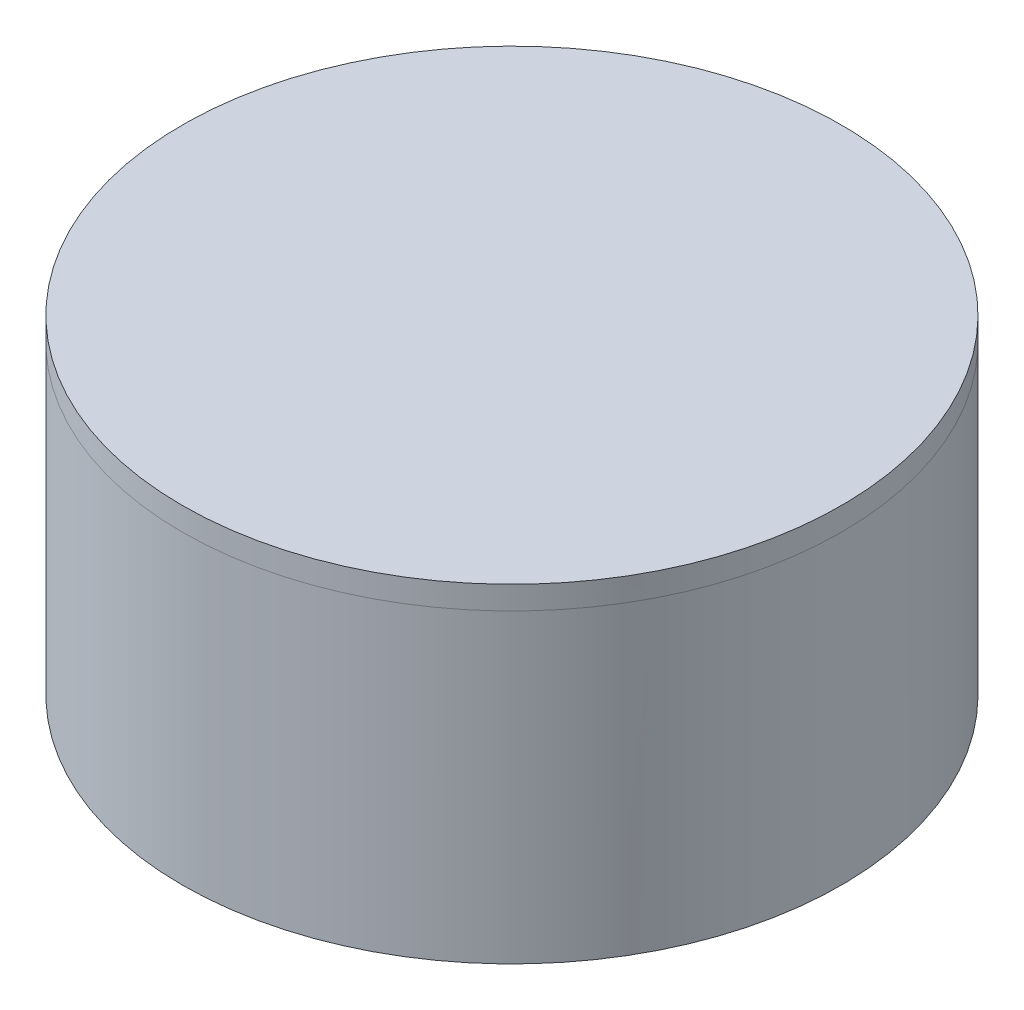
ISO-10303-21;
HEADER;
FILE_DESCRIPTION(('STEP AP214'),'2;1');
FILE_NAME('part.step','',(''),(''),'','','');
FILE_SCHEMA(('AUTOMOTIVE_DESIGN { 1 0 10303 214 1 1 1 1 }'));
ENDSEC;
DATA;
#1=APPLICATION_CONTEXT('core data for automotive mechanical design processes');
#2=APPLICATION_PROTOCOL_DEFINITION('international standard','automotive_design',2000,#1);
#3=PRODUCT_CONTEXT('',#1,'mechanical');
#4=PRODUCT('Part','Part','',(#3));
#5=PRODUCT_RELATED_PRODUCT_CATEGORY('part','',(#4));
#6=PRODUCT_DEFINITION_FORMATION('','',#4);
#7=PRODUCT_DEFINITION_CONTEXT('part definition',#1,'design');
#8=PRODUCT_DEFINITION('design','',#6,#7);
#9=PRODUCT_DEFINITION_SHAPE('','',#8);
#10=(LENGTH_UNIT() NAMED_UNIT(*) SI_UNIT(.MILLI.,.METRE.));
#11=(NAMED_UNIT(*) PLANE_ANGLE_UNIT() SI_UNIT($,.RADIAN.));
#12=(NAMED_UNIT(*) SI_UNIT($,.STERADIAN.) SOLID_ANGLE_UNIT());
#13=UNCERTAINTY_MEASURE_WITH_UNIT(LENGTH_MEASURE(1.E-05),#10,'distance_accuracy_value','');
#14=(GEOMETRIC_REPRESENTATION_CONTEXT(3) GLOBAL_UNCERTAINTY_ASSIGNED_CONTEXT((#13)) GLOBAL_UNIT_ASSIGNED_CONTEXT((#10,
#11,#12)) REPRESENTATION_CONTEXT('',''));
#15=CARTESIAN_POINT('',(0.,0.,0.));
#16=DIRECTION('',(0.,0.,1.));
#17=DIRECTION('',(1.,0.,0.));
#18=AXIS2_PLACEMENT_3D('',#15,#16,#17);
#19=CARTESIAN_POINT('',(0.,36.5219145176376,0.));
#20=DIRECTION('',(0.,-1.,0.));
#21=DIRECTION('',(0.,0.,-1.));
#22=AXIS2_PLACEMENT_3D('',#19,#20,#21);
#23=PLANE('',#22);
#24=CARTESIAN_POINT('',(0.,36.5219145176376,0.));
#25=DIRECTION('',(0.,-1.,0.));
#26=DIRECTION('',(0.,0.,-1.));
#27=AXIS2_PLACEMENT_3D('',#24,#25,#26);
#28=CIRCLE('',#27,85.203979415);
#29=CARTESIAN_POINT('',(0.,36.5219145176376,-85.203979415));
#30=VERTEX_POINT('',#29);
#31=EDGE_CURVE('E50',#30,#30,#28,.T.);
#32=ORIENTED_EDGE('',*,*,#31,.T.);
#33=EDGE_LOOP('',(#32));
#34=FACE_BOUND('',#33,.T.);
#35=CARTESIAN_POINT('',(0.,36.5219145176376,0.));
#36=DIRECTION('',(0.,1.,0.));
#37=DIRECTION('',(-0.010442725131449,0.,0.999945473259332));
#38=AXIS2_PLACEMENT_3D('',#35,#36,#37);
#39=CIRCLE('',#38,76.8418703494323);
#40=CARTESIAN_POINT('',(-0.802438530645569,36.5219145176376,76.8376804126953));
#41=VERTEX_POINT('',#40);
#42=EDGE_CURVE('E56',#41,#41,#39,.T.);
#43=ORIENTED_EDGE('',*,*,#42,.T.);
#44=EDGE_LOOP('',(#43));
#45=FACE_BOUND('',#44,.T.);
#46=ADVANCED_FACE('F42',(#34,#45),#23,.T.);
#47=CARTESIAN_POINT('',(0.,42.5,0.));
#48=DIRECTION('',(0.,1.,0.));
#49=DIRECTION('',(0.,0.,1.));
#50=AXIS2_PLACEMENT_3D('',#47,#48,#49);
#51=CYLINDRICAL_SURFACE('',#50,85.203979415);
#52=CARTESIAN_POINT('',(0.,42.5,0.));
#53=DIRECTION('',(0.,1.,0.));
#54=DIRECTION('',(0.,0.,1.));
#55=AXIS2_PLACEMENT_3D('',#52,#53,#54);
#56=CIRCLE('',#55,85.203979415);
#57=CARTESIAN_POINT('',(0.,42.5,85.203979415));
#58=VERTEX_POINT('',#57);
#59=EDGE_CURVE('E11',#58,#58,#56,.T.);
#60=ORIENTED_EDGE('',*,*,#59,.F.);
#61=EDGE_LOOP('',(#60));
#62=FACE_BOUND('',#61,.T.);
#63=ORIENTED_EDGE('',*,*,#31,.F.);
#64=EDGE_LOOP('',(#63));
#65=FACE_BOUND('',#64,.T.);
#66=ADVANCED_FACE('F44',(#62,#65),#51,.T.);
#67=CARTESIAN_POINT('',(0.,42.5,-85.203979415));
#68=DIRECTION('',(0.,-1.,0.));
#69=DIRECTION('',(0.,0.,-1.));
#70=AXIS2_PLACEMENT_3D('',#67,#68,#69);
#71=PLANE('',#70);
#72=ORIENTED_EDGE('',*,*,#59,.T.);
#73=EDGE_LOOP('',(#72));
#74=FACE_BOUND('',#73,.T.);
#75=ADVANCED_FACE('F86',(#74),#71,.F.);
#76=CARTESIAN_POINT('',(0.,-27.1250492876658,0.));
#77=DIRECTION('',(0.,1.,0.));
#78=DIRECTION('',(-0.010442725131449,0.,0.999945473259332));
#79=AXIS2_PLACEMENT_3D('',#76,#77,#78);
#80=TOROIDAL_SURFACE('',#79,60.6018249710729,3.00000000000001);
#81=CARTESIAN_POINT('',(0.,-27.791315789317,0.));
#82=DIRECTION('',(0.,1.,0.));
#83=DIRECTION('',(-0.010442725131449,0.,0.999945473259332));
#84=AXIS2_PLACEMENT_3D('',#81,#82,#83);
#85=CIRCLE('',#84,63.5269042774811);
#86=CARTESIAN_POINT('',(-0.663393999821614,-27.791315789317,63.5234403624462));
#87=VERTEX_POINT('',#86);
#88=EDGE_CURVE('E69',#87,#87,#85,.T.);
#89=ORIENTED_EDGE('',*,*,#88,.F.);
#90=EDGE_LOOP('',(#89));
#91=FACE_BOUND('',#90,.T.);
#92=CARTESIAN_POINT('',(0.,-28.8902019115234,0.));
#93=DIRECTION('',(0.,1.,0.));
#94=DIRECTION('',(-0.010442725131449,0.,0.999945473259332));
#95=AXIS2_PLACEMENT_3D('',#92,#93,#94);
#96=CIRCLE('',#95,58.1760805050401);
#97=CARTESIAN_POINT('',(-0.607516817939189,-28.8902019115234,58.1729083529854));
#98=VERTEX_POINT('',#97);
#99=EDGE_CURVE('E66',#98,#98,#96,.T.);
#100=ORIENTED_EDGE('',*,*,#99,.T.);
#101=EDGE_LOOP('',(#100));
#102=FACE_BOUND('',#101,.T.);
#103=ADVANCED_FACE('F80',(#91,#102),#80,.T.);
#104=CARTESIAN_POINT('',(0.,-27.791315789317,0.));
#105=DIRECTION('',(0.,1.,0.));
#106=DIRECTION('',(-0.010442725131449,0.,0.999945473259332));
#107=AXIS2_PLACEMENT_3D('',#104,#105,#106);
#108=CONICAL_SURFACE('',#107,63.5269042774811,0.223956285326343);
#109=CARTESIAN_POINT('',(0.,30.6647699152248,0.));
#110=DIRECTION('',(0.,1.,0.));
#111=DIRECTION('',(-0.010442725131449,0.,0.999945473259332));
#112=AXIS2_PLACEMENT_3D('',#109,#110,#111);
#113=CIRCLE('',#112,76.8418703494323);
#114=CARTESIAN_POINT('',(-0.802438530645569,30.6647699152249,76.8376804126953));
#115=VERTEX_POINT('',#114);
#116=EDGE_CURVE('E59',#115,#115,#113,.T.);
#117=ORIENTED_EDGE('',*,*,#116,.F.);
#118=EDGE_LOOP('',(#117));
#119=FACE_BOUND('',#118,.T.);
#120=ORIENTED_EDGE('',*,*,#88,.T.);
#121=EDGE_LOOP('',(#120));
#122=FACE_BOUND('',#121,.T.);
#123=ADVANCED_FACE('F77',(#119,#122),#108,.T.);
#124=CARTESIAN_POINT('',(0.,-1.22114086324985,0.));
#125=DIRECTION('',(0.,1.,0.));
#126=DIRECTION('',(-0.010442725131449,0.,0.999945473259332));
#127=AXIS2_PLACEMENT_3D('',#124,#125,#126);
#128=CYLINDRICAL_SURFACE('',#127,76.8418703494323);
#129=ORIENTED_EDGE('',*,*,#42,.F.);
#130=EDGE_LOOP('',(#129));
#131=FACE_BOUND('',#130,.T.);
#132=ORIENTED_EDGE('',*,*,#116,.T.);
#133=EDGE_LOOP('',(#132));
#134=FACE_BOUND('',#133,.T.);
#135=ADVANCED_FACE('F75',(#131,#134),#128,.T.);
#136=CARTESIAN_POINT('',(0.,19.8823458611719,0.));
#137=DIRECTION('',(0.,-1.,0.));
#138=DIRECTION('',(0.010442725131449,0.,-0.999945473259332));
#139=AXIS2_PLACEMENT_3D('',#136,#137,#138);
#140=CONICAL_SURFACE('',#139,22.6855365179439,0.629059079919699);
#141=ORIENTED_EDGE('',*,*,#99,.F.);
#142=EDGE_LOOP('',(#141));
#143=FACE_BOUND('',#142,.T.);
#144=CARTESIAN_POINT('',(0.,19.8823458611719,0.));
#145=DIRECTION('',(0.,1.,0.));
#146=DIRECTION('',(-0.010442725131449,0.,0.999945473259332));
#147=AXIS2_PLACEMENT_3D('',#144,#145,#146);
#148=CIRCLE('',#147,22.6855365179439);
#149=CARTESIAN_POINT('',(-0.236898822316342,19.8823458611719,22.6842995495772));
#150=VERTEX_POINT('',#149);
#151=EDGE_CURVE('E63',#150,#150,#148,.T.);
#152=ORIENTED_EDGE('',*,*,#151,.T.);
#153=EDGE_LOOP('',(#152));
#154=FACE_BOUND('',#153,.T.);
#155=ADVANCED_FACE('F90',(#143,#154),#140,.F.);
#156=CARTESIAN_POINT('',(0.,6.67345768639848,0.));
#157=DIRECTION('',(0.,1.,0.));
#158=DIRECTION('',(-0.010442725131449,0.,0.999945473259332));
#159=AXIS2_PLACEMENT_3D('',#156,#157,#158);
#160=DEGENERATE_TOROIDAL_SURFACE('',#159,4.5333456199246,22.4494267457279,.T.);
#161=ORIENTED_EDGE('',*,*,#151,.F.);
#162=EDGE_LOOP('',(#161));
#163=FACE_BOUND('',#162,.T.);
#164=CARTESIAN_POINT('',(0.,28.9869598180912,0.));
#165=DIRECTION('',(0.,1.,0.));
#166=DIRECTION('',(-0.010442725131449,0.,0.999945473259332));
#167=AXIS2_PLACEMENT_3D('',#164,#165,#166);
#168=CIRCLE('',#167,7.);
#169=CARTESIAN_POINT('',(-0.0730990759201482,28.9869598180912,6.99961831281533));
#170=VERTEX_POINT('',#169);
#171=EDGE_CURVE('E60',#170,#170,#168,.T.);
#172=ORIENTED_EDGE('',*,*,#171,.T.);
#173=EDGE_LOOP('',(#172));
#174=FACE_BOUND('',#173,.T.);
#175=ADVANCED_FACE('F93',(#163,#174),#160,.F.);
#176=CARTESIAN_POINT('',(0.,-1.22114086324985,0.));
#177=DIRECTION('',(0.,1.,0.));
#178=DIRECTION('',(-0.010442725131449,0.,0.999945473259332));
#179=AXIS2_PLACEMENT_3D('',#176,#177,#178);
#180=CYLINDRICAL_SURFACE('',#179,7.00000000000001);
#181=ORIENTED_EDGE('',*,*,#171,.F.);
#182=EDGE_LOOP('',(#181));
#183=FACE_BOUND('',#182,.T.);
#184=CARTESIAN_POINT('',(0.,36.5219145176376,0.));
#185=DIRECTION('',(0.,1.,0.));
#186=DIRECTION('',(-0.010442725131449,0.,0.999945473259332));
#187=AXIS2_PLACEMENT_3D('',#184,#185,#186);
#188=CIRCLE('',#187,7.00000000000001);
#189=CARTESIAN_POINT('',(-0.0730990759201482,36.5219145176376,6.99961831281533));
#190=VERTEX_POINT('',#189);
#191=EDGE_CURVE('E46',#190,#190,#188,.T.);
#192=ORIENTED_EDGE('',*,*,#191,.T.);
#193=EDGE_LOOP('',(#192));
#194=FACE_BOUND('',#193,.T.);
#195=ADVANCED_FACE('F99',(#183,#194),#180,.F.);
#196=ORIENTED_EDGE('',*,*,#191,.F.);
#197=EDGE_LOOP('',(#196));
#198=FACE_BOUND('',#197,.T.);
#199=ADVANCED_FACE('F105',(#198),#23,.T.);
#200=CLOSED_SHELL('',(#46,#66,#75,#103,#123,#135,#155,#175,#195,#199));
#201=MANIFOLD_SOLID_BREP('B2',#200);
#202=CARTESIAN_POINT('',(0.,36.5219145176376,0.));
#203=DIRECTION('',(0.,-1.,0.));
#204=DIRECTION('',(0.,0.,-1.));
#205=AXIS2_PLACEMENT_3D('',#202,#203,#204);
#206=PLANE('',#205);
#207=CARTESIAN_POINT('',(0.,36.5219145176376,0.));
#208=DIRECTION('',(0.,1.,0.));
#209=DIRECTION('',(-0.010442725131449,0.,0.999945473259332));
#210=AXIS2_PLACEMENT_3D('',#207,#208,#209);
#211=CIRCLE('',#210,79.0589266179777);
#212=CARTESIAN_POINT('',(-0.825590639858945,36.5219145176376,79.0546157923885));
#213=VERTEX_POINT('',#212);
#214=EDGE_CURVE('E210',#213,#213,#211,.T.);
#215=ORIENTED_EDGE('',*,*,#214,.F.);
#216=EDGE_LOOP('',(#215));
#217=FACE_BOUND('',#216,.T.);
#218=CARTESIAN_POINT('',(0.,36.5219145176376,0.));
#219=DIRECTION('',(0.,-1.,0.));
#220=DIRECTION('',(0.,0.,-1.));
#221=AXIS2_PLACEMENT_3D('',#218,#219,#220);
#222=CIRCLE('',#221,85.203979415);
#223=CARTESIAN_POINT('',(0.,36.5219145176376,-85.203979415));
#224=VERTEX_POINT('',#223);
#225=EDGE_CURVE('E198',#224,#224,#222,.T.);
#226=ORIENTED_EDGE('',*,*,#225,.F.);
#227=EDGE_LOOP('',(#226));
#228=FACE_BOUND('',#227,.T.);
#229=ADVANCED_FACE('F195',(#217,#228),#206,.F.);
#230=CARTESIAN_POINT('',(0.,36.5219145176376,0.));
#231=DIRECTION('',(0.,1.,0.));
#232=DIRECTION('',(-0.010442725131449,0.,0.999945473259332));
#233=AXIS2_PLACEMENT_3D('',#230,#231,#232);
#234=CIRCLE('',#233,5.00000000000001);
#235=CARTESIAN_POINT('',(-0.0522136256572501,36.5219145176376,4.99972736629666));
#236=VERTEX_POINT('',#235);
#237=EDGE_CURVE('E41',#236,#236,#234,.T.);
#238=ORIENTED_EDGE('',*,*,#237,.T.);
#239=EDGE_LOOP('',(#238));
#240=FACE_BOUND('',#239,.T.);
#241=ADVANCED_FACE('F243',(#240),#206,.F.);
#242=CARTESIAN_POINT('',(0.,-31.8607080702544,0.));
#243=DIRECTION('',(0.,1.,0.));
#244=DIRECTION('',(-0.010442725131449,0.,0.999945473259332));
#245=AXIS2_PLACEMENT_3D('',#242,#243,#244);
#246=TOROIDAL_SURFACE('',#245,61.5743761028246,2.99999999999999);
#247=CARTESIAN_POINT('',(0.,-33.625860694112,0.));
#248=DIRECTION('',(0.,1.,0.));
#249=DIRECTION('',(-0.010442725131449,0.,0.999945473259332));
#250=AXIS2_PLACEMENT_3D('',#247,#248,#249);
#251=CIRCLE('',#250,59.1486316367918);
#252=CARTESIAN_POINT('',(-0.617672902084352,-33.625860694112,59.1454064546937));
#253=VERTEX_POINT('',#252);
#254=EDGE_CURVE('E219',#253,#253,#251,.T.);
#255=ORIENTED_EDGE('',*,*,#254,.F.);
#256=EDGE_LOOP('',(#255));
#257=FACE_BOUND('',#256,.T.);
#258=CARTESIAN_POINT('',(0.,-32.5269745719057,0.));
#259=DIRECTION('',(0.,1.,0.));
#260=DIRECTION('',(-0.010442725131449,0.,0.999945473259332));
#261=AXIS2_PLACEMENT_3D('',#258,#259,#260);
#262=CIRCLE('',#261,64.4994554092328);
#263=CARTESIAN_POINT('',(-0.673550083966776,-32.5269745719057,64.4959384641544));
#264=VERTEX_POINT('',#263);
#265=EDGE_CURVE('E216',#264,#264,#262,.T.);
#266=ORIENTED_EDGE('',*,*,#265,.T.);
#267=EDGE_LOOP('',(#266));
#268=FACE_BOUND('',#267,.T.);
#269=ADVANCED_FACE('F248',(#257,#268),#246,.F.);
#270=CARTESIAN_POINT('',(0.,31.3928050348992,0.));
#271=DIRECTION('',(0.,1.,0.));
#272=DIRECTION('',(-0.010442725131449,0.,0.999945473259332));
#273=AXIS2_PLACEMENT_3D('',#270,#271,#272);
#274=CONICAL_SURFACE('',#273,79.0589266179777,0.223956285326343);
#275=ORIENTED_EDGE('',*,*,#265,.F.);
#276=EDGE_LOOP('',(#275));
#277=FACE_BOUND('',#276,.T.);
#278=CARTESIAN_POINT('',(0.,31.3928050348992,0.));
#279=DIRECTION('',(0.,1.,0.));
#280=DIRECTION('',(-0.010442725131449,0.,0.999945473259332));
#281=AXIS2_PLACEMENT_3D('',#278,#279,#280);
#282=CIRCLE('',#281,79.0589266179777);
#283=CARTESIAN_POINT('',(-0.825590639858945,31.3928050348993,79.0546157923885));
#284=VERTEX_POINT('',#283);
#285=EDGE_CURVE('E213',#284,#284,#282,.T.);
#286=ORIENTED_EDGE('',*,*,#285,.T.);
#287=EDGE_LOOP('',(#286));
#288=FACE_BOUND('',#287,.T.);
#289=ADVANCED_FACE('F256',(#277,#288),#274,.F.);
#290=CARTESIAN_POINT('',(0.,-1.22114086324985,0.));
#291=DIRECTION('',(0.,1.,0.));
#292=DIRECTION('',(-0.010442725131449,0.,0.999945473259332));
#293=AXIS2_PLACEMENT_3D('',#290,#291,#292);
#294=CYLINDRICAL_SURFACE('',#293,79.0589266179777);
#295=ORIENTED_EDGE('',*,*,#285,.F.);
#296=EDGE_LOOP('',(#295));
#297=FACE_BOUND('',#296,.T.);
#298=ORIENTED_EDGE('',*,*,#214,.T.);
#299=EDGE_LOOP('',(#298));
#300=FACE_BOUND('',#299,.T.);
#301=ADVANCED_FACE('F253',(#297,#300),#294,.F.);
#302=CARTESIAN_POINT('',(0.,-33.625860694112,0.));
#303=DIRECTION('',(0.,-1.,0.));
#304=DIRECTION('',(0.010442725131449,0.,-0.999945473259332));
#305=AXIS2_PLACEMENT_3D('',#302,#303,#304);
#306=CONICAL_SURFACE('',#305,59.1486316367918,0.629059079919701);
#307=CARTESIAN_POINT('',(0.,18.7055774452667,0.));
#308=DIRECTION('',(0.,1.,0.));
#309=DIRECTION('',(-0.010442725131449,0.,0.999945473259332));
#310=AXIS2_PLACEMENT_3D('',#307,#308,#309);
#311=CIRCLE('',#310,21.0683735405886);
#312=CARTESIAN_POINT('',(-0.220011233851065,18.7055774452667,21.0672247508482));
#313=VERTEX_POINT('',#312);
#314=EDGE_CURVE('E222',#313,#313,#311,.T.);
#315=ORIENTED_EDGE('',*,*,#314,.F.);
#316=EDGE_LOOP('',(#315));
#317=FACE_BOUND('',#316,.T.);
#318=ORIENTED_EDGE('',*,*,#254,.T.);
#319=EDGE_LOOP('',(#318));
#320=FACE_BOUND('',#319,.T.);
#321=ADVANCED_FACE('F255',(#317,#320),#306,.T.);
#322=CARTESIAN_POINT('',(0.,6.67345768639848,0.));
#323=DIRECTION('',(0.,1.,0.));
#324=DIRECTION('',(-0.010442725131449,0.,0.999945473259332));
#325=AXIS2_PLACEMENT_3D('',#322,#323,#324);
#326=DEGENERATE_TOROIDAL_SURFACE('',#325,4.5333456199246,20.4494267457277,.T.);
#327=CARTESIAN_POINT('',(0.,27.1175592298374,0.));
#328=DIRECTION('',(0.,1.,0.));
#329=DIRECTION('',(-0.010442725131449,0.,0.999945473259332));
#330=AXIS2_PLACEMENT_3D('',#327,#328,#329);
#331=CIRCLE('',#330,5.00000000000001);
#332=CARTESIAN_POINT('',(-0.0522136256572501,27.1175592298374,4.99972736629666));
#333=VERTEX_POINT('',#332);
#334=EDGE_CURVE('E209',#333,#333,#331,.T.);
#335=ORIENTED_EDGE('',*,*,#334,.F.);
#336=EDGE_LOOP('',(#335));
#337=FACE_BOUND('',#336,.T.);
#338=ORIENTED_EDGE('',*,*,#314,.T.);
#339=EDGE_LOOP('',(#338));
#340=FACE_BOUND('',#339,.T.);
#341=ADVANCED_FACE('F238',(#337,#340),#326,.T.);
#342=CARTESIAN_POINT('',(0.,-1.22114086324985,0.));
#343=DIRECTION('',(0.,1.,0.));
#344=DIRECTION('',(-0.010442725131449,0.,0.999945473259332));
#345=AXIS2_PLACEMENT_3D('',#342,#343,#344);
#346=CYLINDRICAL_SURFACE('',#345,5.00000000000001);
#347=ORIENTED_EDGE('',*,*,#237,.F.);
#348=EDGE_LOOP('',(#347));
#349=FACE_BOUND('',#348,.T.);
#350=ORIENTED_EDGE('',*,*,#334,.T.);
#351=EDGE_LOOP('',(#350));
#352=FACE_BOUND('',#351,.T.);
#353=ADVANCED_FACE('F231',(#349,#352),#346,.T.);
#354=CARTESIAN_POINT('',(0.,-42.5,-85.203979415));
#355=DIRECTION('',(0.,1.,0.));
#356=DIRECTION('',(0.,0.,1.));
#357=AXIS2_PLACEMENT_3D('',#354,#355,#356);
#358=PLANE('',#357);
#359=CARTESIAN_POINT('',(0.,-42.5,0.));
#360=DIRECTION('',(0.,1.,0.));
#361=DIRECTION('',(0.,0.,1.));
#362=AXIS2_PLACEMENT_3D('',#359,#360,#361);
#363=CIRCLE('',#362,85.203979415);
#364=CARTESIAN_POINT('',(0.,-42.5,85.203979415));
#365=VERTEX_POINT('',#364);
#366=EDGE_CURVE('E206',#365,#365,#363,.T.);
#367=ORIENTED_EDGE('',*,*,#366,.F.);
#368=EDGE_LOOP('',(#367));
#369=FACE_BOUND('',#368,.T.);
#370=ADVANCED_FACE('F229',(#369),#358,.F.);
#371=CARTESIAN_POINT('',(0.,42.5,0.));
#372=DIRECTION('',(0.,1.,0.));
#373=DIRECTION('',(0.,0.,1.));
#374=AXIS2_PLACEMENT_3D('',#371,#372,#373);
#375=CYLINDRICAL_SURFACE('',#374,85.203979415);
#376=ORIENTED_EDGE('',*,*,#225,.T.);
#377=EDGE_LOOP('',(#376));
#378=FACE_BOUND('',#377,.T.);
#379=ORIENTED_EDGE('',*,*,#366,.T.);
#380=EDGE_LOOP('',(#379));
#381=FACE_BOUND('',#380,.T.);
#382=ADVANCED_FACE('F227',(#378,#381),#375,.T.);
#383=CLOSED_SHELL('',(#229,#241,#269,#289,#301,#321,#341,#353,#370,#382));
#384=MANIFOLD_SOLID_BREP('B6_NOT_SHOWN',#383);
#385=ADVANCED_BREP_SHAPE_REPRESENTATION('',(#18,#201,#384),#14);
#386=SHAPE_DEFINITION_REPRESENTATION(#9,#385);
ENDSEC;
END-ISO-10303-21;
